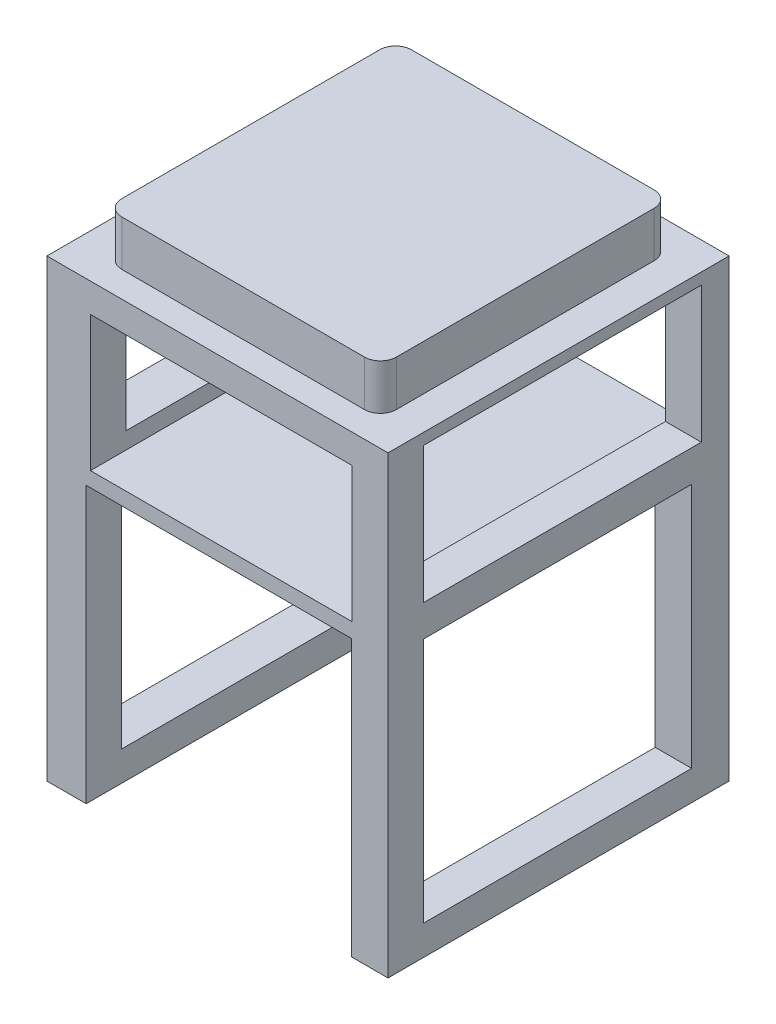
ISO-10303-21;
HEADER;
FILE_DESCRIPTION(('STEP AP214'),'2;1');
FILE_NAME('part.step','',(''),(''),'','','');
FILE_SCHEMA(('AUTOMOTIVE_DESIGN { 1 0 10303 214 1 1 1 1 }'));
ENDSEC;
DATA;
#1=APPLICATION_CONTEXT('core data for automotive mechanical design processes');
#2=APPLICATION_PROTOCOL_DEFINITION('international standard','automotive_design',2000,#1);
#3=PRODUCT_CONTEXT('',#1,'mechanical');
#4=PRODUCT('Part','Part','',(#3));
#5=PRODUCT_RELATED_PRODUCT_CATEGORY('part','',(#4));
#6=PRODUCT_DEFINITION_FORMATION('','',#4);
#7=PRODUCT_DEFINITION_CONTEXT('part definition',#1,'design');
#8=PRODUCT_DEFINITION('design','',#6,#7);
#9=PRODUCT_DEFINITION_SHAPE('','',#8);
#10=(LENGTH_UNIT() NAMED_UNIT(*) SI_UNIT(.MILLI.,.METRE.));
#11=(NAMED_UNIT(*) PLANE_ANGLE_UNIT() SI_UNIT($,.RADIAN.));
#12=(NAMED_UNIT(*) SI_UNIT($,.STERADIAN.) SOLID_ANGLE_UNIT());
#13=UNCERTAINTY_MEASURE_WITH_UNIT(LENGTH_MEASURE(1.E-05),#10,'distance_accuracy_value','');
#14=(GEOMETRIC_REPRESENTATION_CONTEXT(3) GLOBAL_UNCERTAINTY_ASSIGNED_CONTEXT((#13)) GLOBAL_UNIT_ASSIGNED_CONTEXT((#10,
#11,#12)) REPRESENTATION_CONTEXT('',''));
#15=CARTESIAN_POINT('',(0.,0.,0.));
#16=DIRECTION('',(0.,0.,1.));
#17=DIRECTION('',(1.,0.,0.));
#18=AXIS2_PLACEMENT_3D('',#15,#16,#17);
#19=CARTESIAN_POINT('',(0.,2000.,0.));
#20=DIRECTION('',(0.,1.,0.));
#21=DIRECTION('',(0.,0.,1.));
#22=AXIS2_PLACEMENT_3D('',#19,#20,#21);
#23=PLANE('',#22);
#24=DIRECTION('',(0.,0.,-1.));
#25=VECTOR('',#24,1.);
#26=CARTESIAN_POINT('',(750.,2000.,-750.));
#27=LINE('',#26,#25);
#28=CARTESIAN_POINT('',(750.,2000.,750.));
#29=VERTEX_POINT('',#28);
#30=CARTESIAN_POINT('',(750.,2000.,-750.));
#31=VERTEX_POINT('',#30);
#32=EDGE_CURVE('E449',#29,#31,#27,.T.);
#33=ORIENTED_EDGE('',*,*,#32,.T.);
#34=DIRECTION('',(-1.,0.,0.));
#35=VECTOR('',#34,1.);
#36=CARTESIAN_POINT('',(-750.,2000.,-750.));
#37=LINE('',#36,#35);
#38=CARTESIAN_POINT('',(-750.,2000.,-750.));
#39=VERTEX_POINT('',#38);
#40=EDGE_CURVE('E452',#31,#39,#37,.T.);
#41=ORIENTED_EDGE('',*,*,#40,.T.);
#42=DIRECTION('',(0.,0.,1.));
#43=VECTOR('',#42,1.);
#44=CARTESIAN_POINT('',(-750.,2000.,-750.));
#45=LINE('',#44,#43);
#46=CARTESIAN_POINT('',(-750.,2000.,750.));
#47=VERTEX_POINT('',#46);
#48=EDGE_CURVE('E455',#39,#47,#45,.T.);
#49=ORIENTED_EDGE('',*,*,#48,.T.);
#50=DIRECTION('',(1.,0.,0.));
#51=VECTOR('',#50,1.);
#52=CARTESIAN_POINT('',(-750.,2000.,750.));
#53=LINE('',#52,#51);
#54=EDGE_CURVE('E457',#47,#29,#53,.T.);
#55=ORIENTED_EDGE('',*,*,#54,.T.);
#56=EDGE_LOOP('',(#33,#41,#49,#55));
#57=FACE_BOUND('',#56,.T.);
#58=DIRECTION('',(-1.,0.,0.));
#59=VECTOR('',#58,1.);
#60=CARTESIAN_POINT('',(-533.551119556214,2000.,-636.730631364272));
#61=LINE('',#60,#59);
#62=CARTESIAN_POINT('',(533.551119556214,2000.,-636.730631364272));
#63=VERTEX_POINT('',#62);
#64=CARTESIAN_POINT('',(-533.551119556214,2000.,-636.730631364272));
#65=VERTEX_POINT('',#64);
#66=EDGE_CURVE('E903',#63,#65,#61,.T.);
#67=ORIENTED_EDGE('',*,*,#66,.F.);
#68=CARTESIAN_POINT('',(533.551119556214,2000.,-566.730631364272));
#69=DIRECTION('',(0.,1.,0.));
#70=DIRECTION('',(0.,0.,-1.));
#71=AXIS2_PLACEMENT_3D('',#68,#69,#70);
#72=CIRCLE('',#71,70.);
#73=CARTESIAN_POINT('',(603.551119556214,2000.,-566.730631364271));
#74=VERTEX_POINT('',#73);
#75=EDGE_CURVE('E289',#74,#63,#72,.T.);
#76=ORIENTED_EDGE('',*,*,#75,.F.);
#77=DIRECTION('',(0.,0.,-1.));
#78=VECTOR('',#77,1.);
#79=CARTESIAN_POINT('',(603.551119556214,2000.,-566.730631364271));
#80=LINE('',#79,#78);
#81=CARTESIAN_POINT('',(603.551119556214,2000.,566.730631364271));
#82=VERTEX_POINT('',#81);
#83=EDGE_CURVE('E285',#82,#74,#80,.T.);
#84=ORIENTED_EDGE('',*,*,#83,.F.);
#85=CARTESIAN_POINT('',(533.551119556214,2000.,566.730631364272));
#86=DIRECTION('',(0.,1.,0.));
#87=DIRECTION('',(0.,0.,1.));
#88=AXIS2_PLACEMENT_3D('',#85,#86,#87);
#89=CIRCLE('',#88,70.);
#90=CARTESIAN_POINT('',(533.551119556214,2000.,636.730631364272));
#91=VERTEX_POINT('',#90);
#92=EDGE_CURVE('E899',#91,#82,#89,.T.);
#93=ORIENTED_EDGE('',*,*,#92,.F.);
#94=DIRECTION('',(1.,0.,0.));
#95=VECTOR('',#94,1.);
#96=CARTESIAN_POINT('',(-533.551119556214,2000.,636.730631364272));
#97=LINE('',#96,#95);
#98=CARTESIAN_POINT('',(-533.551119556214,2000.,636.730631364272));
#99=VERTEX_POINT('',#98);
#100=EDGE_CURVE('E915',#99,#91,#97,.T.);
#101=ORIENTED_EDGE('',*,*,#100,.F.);
#102=CARTESIAN_POINT('',(-533.551119556214,2000.,566.730631364272));
#103=DIRECTION('',(0.,1.,0.));
#104=DIRECTION('',(0.,0.,1.));
#105=AXIS2_PLACEMENT_3D('',#102,#103,#104);
#106=CIRCLE('',#105,70.);
#107=CARTESIAN_POINT('',(-603.551119556214,2000.,566.730631364271));
#108=VERTEX_POINT('',#107);
#109=EDGE_CURVE('E913',#108,#99,#106,.T.);
#110=ORIENTED_EDGE('',*,*,#109,.F.);
#111=DIRECTION('',(0.,0.,1.));
#112=VECTOR('',#111,1.);
#113=CARTESIAN_POINT('',(-603.551119556214,2000.,-566.730631364271));
#114=LINE('',#113,#112);
#115=CARTESIAN_POINT('',(-603.551119556214,2000.,-566.730631364271));
#116=VERTEX_POINT('',#115);
#117=EDGE_CURVE('E911',#116,#108,#114,.T.);
#118=ORIENTED_EDGE('',*,*,#117,.F.);
#119=CARTESIAN_POINT('',(-533.551119556214,2000.,-566.730631364272));
#120=DIRECTION('',(0.,1.,0.));
#121=DIRECTION('',(0.,0.,1.));
#122=AXIS2_PLACEMENT_3D('',#119,#120,#121);
#123=CIRCLE('',#122,70.);
#124=EDGE_CURVE('E905',#65,#116,#123,.T.);
#125=ORIENTED_EDGE('',*,*,#124,.F.);
#126=EDGE_LOOP('',(#67,#76,#84,#93,#101,#110,#118,#125));
#127=FACE_BOUND('',#126,.T.);
#128=ADVANCED_FACE('F33',(#57,#127),#23,.T.);
#129=CARTESIAN_POINT('',(0.,0.,0.));
#130=DIRECTION('',(0.,1.,0.));
#131=DIRECTION('',(0.,0.,1.));
#132=AXIS2_PLACEMENT_3D('',#129,#130,#131);
#133=PLANE('',#132);
#134=DIRECTION('',(1.,0.,0.));
#135=VECTOR('',#134,1.);
#136=CARTESIAN_POINT('',(-750.,0.,750.));
#137=LINE('',#136,#135);
#138=CARTESIAN_POINT('',(589.857987698919,0.,750.));
#139=VERTEX_POINT('',#138);
#140=CARTESIAN_POINT('',(750.,0.,750.));
#141=VERTEX_POINT('',#140);
#142=EDGE_CURVE('E468',#139,#141,#137,.T.);
#143=ORIENTED_EDGE('',*,*,#142,.F.);
#144=DIRECTION('',(0.,0.,1.));
#145=VECTOR('',#144,1.);
#146=CARTESIAN_POINT('',(589.857987698919,0.,-1250.));
#147=LINE('',#146,#145);
#148=CARTESIAN_POINT('',(589.857987698919,0.,-750.));
#149=VERTEX_POINT('',#148);
#150=EDGE_CURVE('E304',#149,#139,#147,.T.);
#151=ORIENTED_EDGE('',*,*,#150,.F.);
#152=DIRECTION('',(-1.,0.,0.));
#153=VECTOR('',#152,1.);
#154=CARTESIAN_POINT('',(-750.,0.,-750.));
#155=LINE('',#154,#153);
#156=CARTESIAN_POINT('',(750.,0.,-750.));
#157=VERTEX_POINT('',#156);
#158=EDGE_CURVE('E463',#157,#149,#155,.T.);
#159=ORIENTED_EDGE('',*,*,#158,.F.);
#160=DIRECTION('',(0.,0.,-1.));
#161=VECTOR('',#160,1.);
#162=CARTESIAN_POINT('',(750.,0.,-750.));
#163=LINE('',#162,#161);
#164=EDGE_CURVE('E448',#141,#157,#163,.T.);
#165=ORIENTED_EDGE('',*,*,#164,.F.);
#166=EDGE_LOOP('',(#143,#151,#159,#165));
#167=FACE_BOUND('',#166,.T.);
#168=ADVANCED_FACE('F556',(#167),#133,.F.);
#169=CARTESIAN_POINT('',(-1250.,1212.77020270569,-585.35484328997));
#170=DIRECTION('',(0.,0.,-1.));
#171=DIRECTION('',(-1.,0.,0.));
#172=AXIS2_PLACEMENT_3D('',#169,#170,#171);
#173=PLANE('',#172);
#174=DIRECTION('',(1.,0.,0.));
#175=VECTOR('',#174,1.);
#176=CARTESIAN_POINT('',(-1250.,1212.77020270569,-585.35484328997));
#177=LINE('',#176,#175);
#178=CARTESIAN_POINT('',(589.857987698919,1212.77020270569,-585.354843289971));
#179=VERTEX_POINT('',#178);
#180=CARTESIAN_POINT('',(750.,1212.77020270569,-585.354843289971));
#181=VERTEX_POINT('',#180);
#182=EDGE_CURVE('E352',#179,#181,#177,.T.);
#183=ORIENTED_EDGE('',*,*,#182,.F.);
#184=DIRECTION('',(0.,-1.,0.));
#185=VECTOR('',#184,1.);
#186=CARTESIAN_POINT('',(589.857987698918,1212.77020270569,-585.354843289971));
#187=LINE('',#186,#185);
#188=CARTESIAN_POINT('',(589.857987698918,130.70437451714,-585.354843289971));
#189=VERTEX_POINT('',#188);
#190=EDGE_CURVE('E331',#179,#189,#187,.T.);
#191=ORIENTED_EDGE('',*,*,#190,.T.);
#192=DIRECTION('',(1.,0.,0.));
#193=VECTOR('',#192,1.);
#194=CARTESIAN_POINT('',(-1250.,130.70437451714,-585.35484328997));
#195=LINE('',#194,#193);
#196=CARTESIAN_POINT('',(750.,130.70437451714,-585.354843289971));
#197=VERTEX_POINT('',#196);
#198=EDGE_CURVE('E357',#189,#197,#195,.T.);
#199=ORIENTED_EDGE('',*,*,#198,.T.);
#200=DIRECTION('',(0.,1.,0.));
#201=VECTOR('',#200,1.);
#202=CARTESIAN_POINT('',(750.,1212.77020270569,-585.354843289971));
#203=LINE('',#202,#201);
#204=EDGE_CURVE('E340',#197,#181,#203,.T.);
#205=ORIENTED_EDGE('',*,*,#204,.T.);
#206=EDGE_LOOP('',(#183,#191,#199,#205));
#207=FACE_BOUND('',#206,.T.);
#208=ADVANCED_FACE('F540',(#207),#173,.F.);
#209=CARTESIAN_POINT('',(-1250.,130.70437451714,594.091482742061));
#210=DIRECTION('',(0.,-1.,0.));
#211=DIRECTION('',(0.,0.,-1.));
#212=AXIS2_PLACEMENT_3D('',#209,#210,#211);
#213=PLANE('',#212);
#214=ORIENTED_EDGE('',*,*,#198,.F.);
#215=DIRECTION('',(0.,0.,1.));
#216=VECTOR('',#215,1.);
#217=CARTESIAN_POINT('',(589.857987698918,130.70437451714,594.091482742061));
#218=LINE('',#217,#216);
#219=CARTESIAN_POINT('',(589.857987698918,130.70437451714,594.09148274206));
#220=VERTEX_POINT('',#219);
#221=EDGE_CURVE('E328',#189,#220,#218,.T.);
#222=ORIENTED_EDGE('',*,*,#221,.T.);
#223=DIRECTION('',(1.,0.,0.));
#224=VECTOR('',#223,1.);
#225=CARTESIAN_POINT('',(-1250.,130.70437451714,594.091482742061));
#226=LINE('',#225,#224);
#227=CARTESIAN_POINT('',(750.,130.70437451714,594.09148274206));
#228=VERTEX_POINT('',#227);
#229=EDGE_CURVE('E361',#220,#228,#226,.T.);
#230=ORIENTED_EDGE('',*,*,#229,.T.);
#231=DIRECTION('',(0.,0.,-1.));
#232=VECTOR('',#231,1.);
#233=CARTESIAN_POINT('',(750.,130.70437451714,594.09148274206));
#234=LINE('',#233,#232);
#235=EDGE_CURVE('E349',#228,#197,#234,.T.);
#236=ORIENTED_EDGE('',*,*,#235,.T.);
#237=EDGE_LOOP('',(#214,#222,#230,#236));
#238=FACE_BOUND('',#237,.T.);
#239=ADVANCED_FACE('F542',(#238),#213,.F.);
#240=CARTESIAN_POINT('',(-1250.,1212.77020270569,594.091482742061));
#241=DIRECTION('',(0.,0.,1.));
#242=DIRECTION('',(1.,0.,0.));
#243=AXIS2_PLACEMENT_3D('',#240,#241,#242);
#244=PLANE('',#243);
#245=ORIENTED_EDGE('',*,*,#229,.F.);
#246=DIRECTION('',(0.,1.,0.));
#247=VECTOR('',#246,1.);
#248=CARTESIAN_POINT('',(589.857987698918,1212.77020270569,594.091482742061));
#249=LINE('',#248,#247);
#250=CARTESIAN_POINT('',(589.857987698919,1212.77020270569,594.091482742061));
#251=VERTEX_POINT('',#250);
#252=EDGE_CURVE('E325',#220,#251,#249,.T.);
#253=ORIENTED_EDGE('',*,*,#252,.T.);
#254=DIRECTION('',(1.,0.,0.));
#255=VECTOR('',#254,1.);
#256=CARTESIAN_POINT('',(-1250.,1212.77020270569,594.091482742061));
#257=LINE('',#256,#255);
#258=CARTESIAN_POINT('',(750.,1212.77020270569,594.09148274206));
#259=VERTEX_POINT('',#258);
#260=EDGE_CURVE('E365',#251,#259,#257,.T.);
#261=ORIENTED_EDGE('',*,*,#260,.T.);
#262=DIRECTION('',(0.,-1.,0.));
#263=VECTOR('',#262,1.);
#264=CARTESIAN_POINT('',(750.,1212.77020270569,594.09148274206));
#265=LINE('',#264,#263);
#266=EDGE_CURVE('E346',#259,#228,#265,.T.);
#267=ORIENTED_EDGE('',*,*,#266,.T.);
#268=EDGE_LOOP('',(#245,#253,#261,#267));
#269=FACE_BOUND('',#268,.T.);
#270=ADVANCED_FACE('F551',(#269),#244,.F.);
#271=CARTESIAN_POINT('',(750.,2000.,-750.));
#272=DIRECTION('',(-1.,0.,0.));
#273=DIRECTION('',(0.,0.,1.));
#274=AXIS2_PLACEMENT_3D('',#271,#272,#273);
#275=PLANE('',#274);
#276=DIRECTION('',(0.,0.,1.));
#277=VECTOR('',#276,1.);
#278=CARTESIAN_POINT('',(750.,1212.77020270569,594.09148274206));
#279=LINE('',#278,#277);
#280=EDGE_CURVE('E343',#181,#259,#279,.T.);
#281=ORIENTED_EDGE('',*,*,#280,.F.);
#282=ORIENTED_EDGE('',*,*,#204,.F.);
#283=ORIENTED_EDGE('',*,*,#235,.F.);
#284=ORIENTED_EDGE('',*,*,#266,.F.);
#285=EDGE_LOOP('',(#281,#282,#283,#284));
#286=FACE_BOUND('',#285,.T.);
#287=ORIENTED_EDGE('',*,*,#164,.T.);
#288=DIRECTION('',(0.,-1.,0.));
#289=VECTOR('',#288,1.);
#290=CARTESIAN_POINT('',(750.,2000.,-750.));
#291=LINE('',#290,#289);
#292=EDGE_CURVE('E479',#31,#157,#291,.T.);
#293=ORIENTED_EDGE('',*,*,#292,.F.);
#294=ORIENTED_EDGE('',*,*,#32,.F.);
#295=DIRECTION('',(0.,-1.,0.));
#296=VECTOR('',#295,1.);
#297=CARTESIAN_POINT('',(750.,2000.,750.));
#298=LINE('',#297,#296);
#299=EDGE_CURVE('E459',#29,#141,#298,.T.);
#300=ORIENTED_EDGE('',*,*,#299,.T.);
#301=EDGE_LOOP('',(#287,#293,#294,#300));
#302=FACE_BOUND('',#301,.T.);
#303=DIRECTION('',(0.,-1.,0.));
#304=VECTOR('',#303,1.);
#305=CARTESIAN_POINT('',(750.,0.,-627.777429765277));
#306=LINE('',#305,#304);
#307=CARTESIAN_POINT('',(750.,1950.09268732934,-627.777429765277));
#308=VERTEX_POINT('',#307);
#309=CARTESIAN_POINT('',(750.,1351.808156949,-627.777429765277));
#310=VERTEX_POINT('',#309);
#311=EDGE_CURVE('E356',#308,#310,#306,.T.);
#312=ORIENTED_EDGE('',*,*,#311,.T.);
#313=DIRECTION('',(0.,0.,-1.));
#314=VECTOR('',#313,1.);
#315=CARTESIAN_POINT('',(750.,1351.808156949,-1.28452768236437E-13));
#316=LINE('',#315,#314);
#317=CARTESIAN_POINT('',(750.,1351.808156949,594.071259039625));
#318=VERTEX_POINT('',#317);
#319=EDGE_CURVE('E377',#318,#310,#316,.T.);
#320=ORIENTED_EDGE('',*,*,#319,.F.);
#321=DIRECTION('',(0.,-1.,0.));
#322=VECTOR('',#321,1.);
#323=CARTESIAN_POINT('',(750.,-1.10240455262075E-13,594.071259039625));
#324=LINE('',#323,#322);
#325=CARTESIAN_POINT('',(750.,1950.09268732934,594.071259039625));
#326=VERTEX_POINT('',#325);
#327=EDGE_CURVE('E374',#326,#318,#324,.T.);
#328=ORIENTED_EDGE('',*,*,#327,.F.);
#329=DIRECTION('',(0.,0.,-1.));
#330=VECTOR('',#329,1.);
#331=CARTESIAN_POINT('',(750.,1950.09268732934,-1.28452768236437E-13));
#332=LINE('',#331,#330);
#333=EDGE_CURVE('E371',#326,#308,#332,.T.);
#334=ORIENTED_EDGE('',*,*,#333,.T.);
#335=EDGE_LOOP('',(#312,#320,#328,#334));
#336=FACE_BOUND('',#335,.T.);
#337=ADVANCED_FACE('F35',(#286,#302,#336),#275,.F.);
#338=CARTESIAN_POINT('',(-750.,2000.,-750.));
#339=DIRECTION('',(1.,0.,0.));
#340=DIRECTION('',(0.,0.,-1.));
#341=AXIS2_PLACEMENT_3D('',#338,#339,#340);
#342=PLANE('',#341);
#343=DIRECTION('',(0.,0.,-1.));
#344=VECTOR('',#343,1.);
#345=CARTESIAN_POINT('',(-750.,130.70437451714,-750.));
#346=LINE('',#345,#344);
#347=CARTESIAN_POINT('',(-750.,130.70437451714,594.091482742061));
#348=VERTEX_POINT('',#347);
#349=CARTESIAN_POINT('',(-750.,130.70437451714,-585.35484328997));
#350=VERTEX_POINT('',#349);
#351=EDGE_CURVE('E41',#348,#350,#346,.T.);
#352=ORIENTED_EDGE('',*,*,#351,.T.);
#353=DIRECTION('',(0.,1.,0.));
#354=VECTOR('',#353,1.);
#355=CARTESIAN_POINT('',(-750.,2000.,-585.35484328997));
#356=LINE('',#355,#354);
#357=CARTESIAN_POINT('',(-750.,1212.77020270569,-585.35484328997));
#358=VERTEX_POINT('',#357);
#359=EDGE_CURVE('E11',#350,#358,#356,.T.);
#360=ORIENTED_EDGE('',*,*,#359,.T.);
#361=DIRECTION('',(0.,0.,1.));
#362=VECTOR('',#361,1.);
#363=CARTESIAN_POINT('',(-750.,1212.77020270569,-750.));
#364=LINE('',#363,#362);
#365=CARTESIAN_POINT('',(-750.,1212.77020270569,594.091482742061));
#366=VERTEX_POINT('',#365);
#367=EDGE_CURVE('E492',#358,#366,#364,.T.);
#368=ORIENTED_EDGE('',*,*,#367,.T.);
#369=DIRECTION('',(0.,-1.,0.));
#370=VECTOR('',#369,1.);
#371=CARTESIAN_POINT('',(-750.,2000.,594.091482742061));
#372=LINE('',#371,#370);
#373=EDGE_CURVE('E495',#366,#348,#372,.T.);
#374=ORIENTED_EDGE('',*,*,#373,.T.);
#375=EDGE_LOOP('',(#352,#360,#368,#374));
#376=FACE_BOUND('',#375,.T.);
#377=DIRECTION('',(0.,0.,1.));
#378=VECTOR('',#377,1.);
#379=CARTESIAN_POINT('',(-750.,0.,-750.));
#380=LINE('',#379,#378);
#381=CARTESIAN_POINT('',(-750.,0.,-750.));
#382=VERTEX_POINT('',#381);
#383=CARTESIAN_POINT('',(-750.,0.,750.));
#384=VERTEX_POINT('',#383);
#385=EDGE_CURVE('E466',#382,#384,#380,.T.);
#386=ORIENTED_EDGE('',*,*,#385,.T.);
#387=DIRECTION('',(0.,-1.,0.));
#388=VECTOR('',#387,1.);
#389=CARTESIAN_POINT('',(-750.,2000.,750.));
#390=LINE('',#389,#388);
#391=EDGE_CURVE('E473',#47,#384,#390,.T.);
#392=ORIENTED_EDGE('',*,*,#391,.F.);
#393=ORIENTED_EDGE('',*,*,#48,.F.);
#394=DIRECTION('',(0.,-1.,0.));
#395=VECTOR('',#394,1.);
#396=CARTESIAN_POINT('',(-750.,2000.,-750.));
#397=LINE('',#396,#395);
#398=EDGE_CURVE('E476',#39,#382,#397,.T.);
#399=ORIENTED_EDGE('',*,*,#398,.T.);
#400=EDGE_LOOP('',(#386,#392,#393,#399));
#401=FACE_BOUND('',#400,.T.);
#402=DIRECTION('',(0.,-1.,0.));
#403=VECTOR('',#402,1.);
#404=CARTESIAN_POINT('',(-750.,2000.,-627.777429765277));
#405=LINE('',#404,#403);
#406=CARTESIAN_POINT('',(-750.,1950.09268732934,-627.777429765277));
#407=VERTEX_POINT('',#406);
#408=CARTESIAN_POINT('',(-750.,1351.808156949,-627.777429765277));
#409=VERTEX_POINT('',#408);
#410=EDGE_CURVE('E404',#407,#409,#405,.T.);
#411=ORIENTED_EDGE('',*,*,#410,.F.);
#412=DIRECTION('',(0.,0.,-1.));
#413=VECTOR('',#412,1.);
#414=CARTESIAN_POINT('',(-750.,1950.09268732934,-750.));
#415=LINE('',#414,#413);
#416=CARTESIAN_POINT('',(-750.,1950.09268732934,594.071259039625));
#417=VERTEX_POINT('',#416);
#418=EDGE_CURVE('E490',#417,#407,#415,.T.);
#419=ORIENTED_EDGE('',*,*,#418,.F.);
#420=DIRECTION('',(0.,-1.,0.));
#421=VECTOR('',#420,1.);
#422=CARTESIAN_POINT('',(-750.,2000.,594.071259039625));
#423=LINE('',#422,#421);
#424=CARTESIAN_POINT('',(-750.,1351.808156949,594.071259039625));
#425=VERTEX_POINT('',#424);
#426=EDGE_CURVE('E397',#417,#425,#423,.T.);
#427=ORIENTED_EDGE('',*,*,#426,.T.);
#428=DIRECTION('',(0.,0.,-1.));
#429=VECTOR('',#428,1.);
#430=CARTESIAN_POINT('',(-750.,1351.808156949,-750.));
#431=LINE('',#430,#429);
#432=EDGE_CURVE('E409',#425,#409,#431,.T.);
#433=ORIENTED_EDGE('',*,*,#432,.T.);
#434=EDGE_LOOP('',(#411,#419,#427,#433));
#435=FACE_BOUND('',#434,.T.);
#436=ADVANCED_FACE('F499',(#376,#401,#435),#342,.F.);
#437=CARTESIAN_POINT('',(592.401457428046,1873.00608050566,-1250.));
#438=DIRECTION('',(1.,0.,0.));
#439=DIRECTION('',(0.,0.,-1.));
#440=AXIS2_PLACEMENT_3D('',#437,#438,#439);
#441=PLANE('',#440);
#442=DIRECTION('',(0.,-1.,0.));
#443=VECTOR('',#442,1.);
#444=CARTESIAN_POINT('',(592.401457428046,1873.00608050566,-627.777429765277));
#445=LINE('',#444,#443);
#446=CARTESIAN_POINT('',(592.401457428046,1873.00608050566,-627.777429765277));
#447=VERTEX_POINT('',#446);
#448=CARTESIAN_POINT('',(592.401457428046,1351.808156949,-627.777429765277));
#449=VERTEX_POINT('',#448);
#450=EDGE_CURVE('E402',#447,#449,#445,.T.);
#451=ORIENTED_EDGE('',*,*,#450,.F.);
#452=DIRECTION('',(0.,0.,1.));
#453=VECTOR('',#452,1.);
#454=CARTESIAN_POINT('',(592.401457428046,1873.00608050566,-1250.));
#455=LINE('',#454,#453);
#456=CARTESIAN_POINT('',(592.401457428046,1873.00608050566,-750.));
#457=VERTEX_POINT('',#456);
#458=EDGE_CURVE('E434',#457,#447,#455,.T.);
#459=ORIENTED_EDGE('',*,*,#458,.F.);
#460=DIRECTION('',(0.,1.,0.));
#461=VECTOR('',#460,1.);
#462=CARTESIAN_POINT('',(592.401457428046,2000.,-750.));
#463=LINE('',#462,#461);
#464=CARTESIAN_POINT('',(592.401457428046,1278.14640930617,-750.));
#465=VERTEX_POINT('',#464);
#466=EDGE_CURVE('E445',#465,#457,#463,.T.);
#467=ORIENTED_EDGE('',*,*,#466,.F.);
#468=DIRECTION('',(0.,0.,1.));
#469=VECTOR('',#468,1.);
#470=CARTESIAN_POINT('',(592.401457428046,1278.14640930617,-1250.));
#471=LINE('',#470,#469);
#472=CARTESIAN_POINT('',(592.401457428046,1278.14640930617,750.));
#473=VERTEX_POINT('',#472);
#474=EDGE_CURVE('E425',#465,#473,#471,.T.);
#475=ORIENTED_EDGE('',*,*,#474,.T.);
#476=DIRECTION('',(0.,1.,0.));
#477=VECTOR('',#476,1.);
#478=CARTESIAN_POINT('',(592.401457428046,1873.00608050566,750.));
#479=LINE('',#478,#477);
#480=CARTESIAN_POINT('',(592.401457428046,1873.00608050566,750.));
#481=VERTEX_POINT('',#480);
#482=EDGE_CURVE('E412',#473,#481,#479,.T.);
#483=ORIENTED_EDGE('',*,*,#482,.T.);
#484=CARTESIAN_POINT('',(592.401457428046,1873.00608050566,594.071259039625));
#485=VERTEX_POINT('',#484);
#486=EDGE_CURVE('E424',#485,#481,#455,.T.);
#487=ORIENTED_EDGE('',*,*,#486,.F.);
#488=DIRECTION('',(0.,-1.,0.));
#489=VECTOR('',#488,1.);
#490=CARTESIAN_POINT('',(592.401457428046,1873.00608050566,594.071259039625));
#491=LINE('',#490,#489);
#492=CARTESIAN_POINT('',(592.401457428046,1351.808156949,594.071259039625));
#493=VERTEX_POINT('',#492);
#494=EDGE_CURVE('E394',#485,#493,#491,.T.);
#495=ORIENTED_EDGE('',*,*,#494,.T.);
#496=DIRECTION('',(0.,0.,-1.));
#497=VECTOR('',#496,1.);
#498=CARTESIAN_POINT('',(592.401457428046,1351.808156949,-1250.));
#499=LINE('',#498,#497);
#500=EDGE_CURVE('E406',#493,#449,#499,.T.);
#501=ORIENTED_EDGE('',*,*,#500,.T.);
#502=EDGE_LOOP('',(#451,#459,#467,#475,#483,#487,#495,#501));
#503=FACE_BOUND('',#502,.T.);
#504=ADVANCED_FACE('F565',(#503),#441,.F.);
#505=CARTESIAN_POINT('',(-558.551317086931,1873.00608050566,-1250.));
#506=DIRECTION('',(-1.,0.,0.));
#507=DIRECTION('',(0.,0.,1.));
#508=AXIS2_PLACEMENT_3D('',#505,#506,#507);
#509=PLANE('',#508);
#510=DIRECTION('',(0.,1.,0.));
#511=VECTOR('',#510,1.);
#512=CARTESIAN_POINT('',(-558.551317086931,1873.00608050566,-627.777429765277));
#513=LINE('',#512,#511);
#514=CARTESIAN_POINT('',(-558.551317086931,1351.808156949,-627.777429765277));
#515=VERTEX_POINT('',#514);
#516=CARTESIAN_POINT('',(-558.551317086931,1873.00608050566,-627.777429765277));
#517=VERTEX_POINT('',#516);
#518=EDGE_CURVE('E400',#515,#517,#513,.T.);
#519=ORIENTED_EDGE('',*,*,#518,.F.);
#520=DIRECTION('',(0.,0.,1.));
#521=VECTOR('',#520,1.);
#522=CARTESIAN_POINT('',(-558.551317086931,1351.808156949,-1250.));
#523=LINE('',#522,#521);
#524=CARTESIAN_POINT('',(-558.551317086931,1351.808156949,594.071259039625));
#525=VERTEX_POINT('',#524);
#526=EDGE_CURVE('E487',#515,#525,#523,.T.);
#527=ORIENTED_EDGE('',*,*,#526,.T.);
#528=DIRECTION('',(0.,1.,0.));
#529=VECTOR('',#528,1.);
#530=CARTESIAN_POINT('',(-558.551317086931,1873.00608050566,594.071259039625));
#531=LINE('',#530,#529);
#532=CARTESIAN_POINT('',(-558.551317086931,1873.00608050566,594.071259039625));
#533=VERTEX_POINT('',#532);
#534=EDGE_CURVE('E391',#525,#533,#531,.T.);
#535=ORIENTED_EDGE('',*,*,#534,.T.);
#536=DIRECTION('',(0.,0.,1.));
#537=VECTOR('',#536,1.);
#538=CARTESIAN_POINT('',(-558.551317086931,1873.00608050566,-1250.));
#539=LINE('',#538,#537);
#540=CARTESIAN_POINT('',(-558.551317086931,1873.00608050566,750.));
#541=VERTEX_POINT('',#540);
#542=EDGE_CURVE('E433',#533,#541,#539,.T.);
#543=ORIENTED_EDGE('',*,*,#542,.T.);
#544=DIRECTION('',(0.,-1.,0.));
#545=VECTOR('',#544,1.);
#546=CARTESIAN_POINT('',(-558.551317086931,1873.00608050566,750.));
#547=LINE('',#546,#545);
#548=CARTESIAN_POINT('',(-558.551317086931,1278.14640930617,750.));
#549=VERTEX_POINT('',#548);
#550=EDGE_CURVE('E418',#541,#549,#547,.T.);
#551=ORIENTED_EDGE('',*,*,#550,.T.);
#552=DIRECTION('',(0.,0.,1.));
#553=VECTOR('',#552,1.);
#554=CARTESIAN_POINT('',(-558.551317086931,1278.14640930617,-1250.));
#555=LINE('',#554,#553);
#556=CARTESIAN_POINT('',(-558.551317086931,1278.14640930617,-750.));
#557=VERTEX_POINT('',#556);
#558=EDGE_CURVE('E428',#557,#549,#555,.T.);
#559=ORIENTED_EDGE('',*,*,#558,.F.);
#560=DIRECTION('',(0.,-1.,0.));
#561=VECTOR('',#560,1.);
#562=CARTESIAN_POINT('',(-558.551317086931,2000.,-750.));
#563=LINE('',#562,#561);
#564=CARTESIAN_POINT('',(-558.551317086931,1873.00608050566,-750.));
#565=VERTEX_POINT('',#564);
#566=EDGE_CURVE('E439',#565,#557,#563,.T.);
#567=ORIENTED_EDGE('',*,*,#566,.F.);
#568=EDGE_CURVE('E430',#565,#517,#539,.T.);
#569=ORIENTED_EDGE('',*,*,#568,.T.);
#570=EDGE_LOOP('',(#519,#527,#535,#543,#551,#559,#567,#569));
#571=FACE_BOUND('',#570,.T.);
#572=ADVANCED_FACE('F580',(#571),#509,.F.);
#573=CARTESIAN_POINT('',(-558.551317086931,1873.00608050566,-1250.));
#574=DIRECTION('',(0.,1.,0.));
#575=DIRECTION('',(0.,0.,1.));
#576=AXIS2_PLACEMENT_3D('',#573,#574,#575);
#577=PLANE('',#576);
#578=DIRECTION('',(1.,0.,0.));
#579=VECTOR('',#578,1.);
#580=CARTESIAN_POINT('',(-558.55131708693,1873.00608050566,-627.777429765277));
#581=LINE('',#580,#579);
#582=EDGE_CURVE('E485',#517,#447,#581,.T.);
#583=ORIENTED_EDGE('',*,*,#582,.F.);
#584=ORIENTED_EDGE('',*,*,#568,.F.);
#585=DIRECTION('',(-1.,0.,0.));
#586=VECTOR('',#585,1.);
#587=CARTESIAN_POINT('',(-750.,1873.00608050566,-750.));
#588=LINE('',#587,#586);
#589=EDGE_CURVE('E427',#457,#565,#588,.T.);
#590=ORIENTED_EDGE('',*,*,#589,.F.);
#591=ORIENTED_EDGE('',*,*,#458,.T.);
#592=EDGE_LOOP('',(#583,#584,#590,#591));
#593=FACE_BOUND('',#592,.T.);
#594=ADVANCED_FACE('F586',(#593),#577,.F.);
#595=CARTESIAN_POINT('',(-750.,2000.,-750.));
#596=DIRECTION('',(0.,0.,1.));
#597=DIRECTION('',(1.,0.,0.));
#598=AXIS2_PLACEMENT_3D('',#595,#596,#597);
#599=PLANE('',#598);
#600=ORIENTED_EDGE('',*,*,#158,.T.);
#601=DIRECTION('',(0.,1.,0.));
#602=VECTOR('',#601,1.);
#603=CARTESIAN_POINT('',(589.857987698919,2000.,-750.));
#604=LINE('',#603,#602);
#605=CARTESIAN_POINT('',(589.857987698919,1212.77020270569,-750.));
#606=VERTEX_POINT('',#605);
#607=EDGE_CURVE('E334',#149,#606,#604,.T.);
#608=ORIENTED_EDGE('',*,*,#607,.T.);
#609=DIRECTION('',(-1.,0.,0.));
#610=VECTOR('',#609,1.);
#611=CARTESIAN_POINT('',(-750.,1212.77020270569,-750.));
#612=LINE('',#611,#610);
#613=CARTESIAN_POINT('',(-577.218173676799,1212.77020270569,-750.));
#614=VERTEX_POINT('',#613);
#615=EDGE_CURVE('E337',#606,#614,#612,.T.);
#616=ORIENTED_EDGE('',*,*,#615,.T.);
#617=DIRECTION('',(0.,-1.,0.));
#618=VECTOR('',#617,1.);
#619=CARTESIAN_POINT('',(-577.218173676799,2000.,-750.));
#620=LINE('',#619,#618);
#621=CARTESIAN_POINT('',(-577.218173676798,0.,-750.));
#622=VERTEX_POINT('',#621);
#623=EDGE_CURVE('E322',#614,#622,#620,.T.);
#624=ORIENTED_EDGE('',*,*,#623,.T.);
#625=EDGE_CURVE('E462',#622,#382,#155,.T.);
#626=ORIENTED_EDGE('',*,*,#625,.T.);
#627=ORIENTED_EDGE('',*,*,#398,.F.);
#628=ORIENTED_EDGE('',*,*,#40,.F.);
#629=ORIENTED_EDGE('',*,*,#292,.T.);
#630=EDGE_LOOP('',(#600,#608,#616,#624,#626,#627,#628,#629));
#631=FACE_BOUND('',#630,.T.);
#632=DIRECTION('',(1.,0.,0.));
#633=VECTOR('',#632,1.);
#634=CARTESIAN_POINT('',(-750.,1278.14640930617,-750.));
#635=LINE('',#634,#633);
#636=EDGE_CURVE('E442',#557,#465,#635,.T.);
#637=ORIENTED_EDGE('',*,*,#636,.T.);
#638=ORIENTED_EDGE('',*,*,#466,.T.);
#639=ORIENTED_EDGE('',*,*,#589,.T.);
#640=ORIENTED_EDGE('',*,*,#566,.T.);
#641=EDGE_LOOP('',(#637,#638,#639,#640));
#642=FACE_BOUND('',#641,.T.);
#643=ADVANCED_FACE('F529',(#631,#642),#599,.F.);
#644=CARTESIAN_POINT('',(-750.,2000.,750.));
#645=DIRECTION('',(0.,0.,-1.));
#646=DIRECTION('',(-1.,0.,0.));
#647=AXIS2_PLACEMENT_3D('',#644,#645,#646);
#648=PLANE('',#647);
#649=DIRECTION('',(-1.,0.,0.));
#650=VECTOR('',#649,1.);
#651=CARTESIAN_POINT('',(-558.551317086931,1873.00608050566,750.));
#652=LINE('',#651,#650);
#653=EDGE_CURVE('E415',#481,#541,#652,.T.);
#654=ORIENTED_EDGE('',*,*,#653,.F.);
#655=ORIENTED_EDGE('',*,*,#482,.F.);
#656=DIRECTION('',(1.,0.,0.));
#657=VECTOR('',#656,1.);
#658=CARTESIAN_POINT('',(-558.551317086931,1278.14640930617,750.));
#659=LINE('',#658,#657);
#660=EDGE_CURVE('E421',#549,#473,#659,.T.);
#661=ORIENTED_EDGE('',*,*,#660,.F.);
#662=ORIENTED_EDGE('',*,*,#550,.F.);
#663=EDGE_LOOP('',(#654,#655,#661,#662));
#664=FACE_BOUND('',#663,.T.);
#665=DIRECTION('',(-1.,0.,0.));
#666=VECTOR('',#665,1.);
#667=CARTESIAN_POINT('',(-577.218173676799,1212.77020270569,750.));
#668=LINE('',#667,#666);
#669=CARTESIAN_POINT('',(589.857987698919,1212.77020270569,750.));
#670=VERTEX_POINT('',#669);
#671=CARTESIAN_POINT('',(-577.218173676799,1212.77020270569,750.));
#672=VERTEX_POINT('',#671);
#673=EDGE_CURVE('E294',#670,#672,#668,.T.);
#674=ORIENTED_EDGE('',*,*,#673,.F.);
#675=DIRECTION('',(0.,1.,0.));
#676=VECTOR('',#675,1.);
#677=CARTESIAN_POINT('',(589.857987698919,1212.77020270569,750.));
#678=LINE('',#677,#676);
#679=EDGE_CURVE('E291',#139,#670,#678,.T.);
#680=ORIENTED_EDGE('',*,*,#679,.F.);
#681=ORIENTED_EDGE('',*,*,#142,.T.);
#682=ORIENTED_EDGE('',*,*,#299,.F.);
#683=ORIENTED_EDGE('',*,*,#54,.F.);
#684=ORIENTED_EDGE('',*,*,#391,.T.);
#685=CARTESIAN_POINT('',(-577.218173676799,0.,750.));
#686=VERTEX_POINT('',#685);
#687=EDGE_CURVE('E453',#384,#686,#137,.T.);
#688=ORIENTED_EDGE('',*,*,#687,.T.);
#689=DIRECTION('',(0.,-1.,0.));
#690=VECTOR('',#689,1.);
#691=CARTESIAN_POINT('',(-577.218173676799,1212.77020270569,750.));
#692=LINE('',#691,#690);
#693=EDGE_CURVE('E56',#672,#686,#692,.T.);
#694=ORIENTED_EDGE('',*,*,#693,.F.);
#695=EDGE_LOOP('',(#674,#680,#681,#682,#683,#684,#688,#694));
#696=FACE_BOUND('',#695,.T.);
#697=ADVANCED_FACE('F520',(#664,#696),#648,.F.);
#698=ORIENTED_EDGE('',*,*,#625,.F.);
#699=DIRECTION('',(0.,0.,1.));
#700=VECTOR('',#699,1.);
#701=CARTESIAN_POINT('',(-577.218173676798,0.,-1250.));
#702=LINE('',#701,#700);
#703=EDGE_CURVE('E307',#622,#686,#702,.T.);
#704=ORIENTED_EDGE('',*,*,#703,.T.);
#705=ORIENTED_EDGE('',*,*,#687,.F.);
#706=ORIENTED_EDGE('',*,*,#385,.F.);
#707=EDGE_LOOP('',(#698,#704,#705,#706));
#708=FACE_BOUND('',#707,.T.);
#709=ADVANCED_FACE('F527',(#708),#133,.F.);
#710=CARTESIAN_POINT('',(-558.551317086931,1278.14640930617,-1250.));
#711=DIRECTION('',(0.,-1.,0.));
#712=DIRECTION('',(0.,0.,-1.));
#713=AXIS2_PLACEMENT_3D('',#710,#711,#712);
#714=PLANE('',#713);
#715=ORIENTED_EDGE('',*,*,#558,.T.);
#716=ORIENTED_EDGE('',*,*,#660,.T.);
#717=ORIENTED_EDGE('',*,*,#474,.F.);
#718=ORIENTED_EDGE('',*,*,#636,.F.);
#719=EDGE_LOOP('',(#715,#716,#717,#718));
#720=FACE_BOUND('',#719,.T.);
#721=ADVANCED_FACE('F592',(#720),#714,.F.);
#722=ORIENTED_EDGE('',*,*,#542,.F.);
#723=DIRECTION('',(1.,0.,0.));
#724=VECTOR('',#723,1.);
#725=CARTESIAN_POINT('',(-558.55131708693,1873.00608050566,594.071259039625));
#726=LINE('',#725,#724);
#727=EDGE_CURVE('E482',#533,#485,#726,.T.);
#728=ORIENTED_EDGE('',*,*,#727,.T.);
#729=ORIENTED_EDGE('',*,*,#486,.T.);
#730=ORIENTED_EDGE('',*,*,#653,.T.);
#731=EDGE_LOOP('',(#722,#728,#729,#730));
#732=FACE_BOUND('',#731,.T.);
#733=ADVANCED_FACE('F600',(#732),#577,.F.);
#734=CARTESIAN_POINT('',(-1250.,1950.09268732934,1.67606704996938E-13));
#735=DIRECTION('',(0.,-1.,0.));
#736=DIRECTION('',(0.,0.,-1.));
#737=AXIS2_PLACEMENT_3D('',#734,#735,#736);
#738=PLANE('',#737);
#739=ORIENTED_EDGE('',*,*,#418,.T.);
#740=DIRECTION('',(1.,0.,0.));
#741=VECTOR('',#740,1.);
#742=CARTESIAN_POINT('',(-1250.,1950.09268732934,-627.777429765277));
#743=LINE('',#742,#741);
#744=EDGE_CURVE('E380',#407,#308,#743,.T.);
#745=ORIENTED_EDGE('',*,*,#744,.T.);
#746=ORIENTED_EDGE('',*,*,#333,.F.);
#747=DIRECTION('',(1.,0.,0.));
#748=VECTOR('',#747,1.);
#749=CARTESIAN_POINT('',(-1250.,1950.09268732934,594.071259039625));
#750=LINE('',#749,#748);
#751=EDGE_CURVE('E387',#417,#326,#750,.T.);
#752=ORIENTED_EDGE('',*,*,#751,.F.);
#753=EDGE_LOOP('',(#739,#745,#746,#752));
#754=FACE_BOUND('',#753,.T.);
#755=ADVANCED_FACE('F611',(#754),#738,.T.);
#756=CARTESIAN_POINT('',(-1250.,1351.808156949,1.67606704996938E-13));
#757=DIRECTION('',(0.,-1.,0.));
#758=DIRECTION('',(0.,0.,-1.));
#759=AXIS2_PLACEMENT_3D('',#756,#757,#758);
#760=PLANE('',#759);
#761=DIRECTION('',(1.,0.,0.));
#762=VECTOR('',#761,1.);
#763=CARTESIAN_POINT('',(-1250.,1351.808156949,594.071259039625));
#764=LINE('',#763,#762);
#765=EDGE_CURVE('E384',#425,#525,#764,.T.);
#766=ORIENTED_EDGE('',*,*,#765,.T.);
#767=ORIENTED_EDGE('',*,*,#526,.F.);
#768=DIRECTION('',(1.,0.,0.));
#769=VECTOR('',#768,1.);
#770=CARTESIAN_POINT('',(-1250.,1351.808156949,-627.777429765277));
#771=LINE('',#770,#769);
#772=EDGE_CURVE('E383',#409,#515,#771,.T.);
#773=ORIENTED_EDGE('',*,*,#772,.F.);
#774=ORIENTED_EDGE('',*,*,#432,.F.);
#775=EDGE_LOOP('',(#766,#767,#773,#774));
#776=FACE_BOUND('',#775,.T.);
#777=ADVANCED_FACE('F577',(#776),#760,.F.);
#778=EDGE_CURVE('E385',#493,#318,#764,.T.);
#779=ORIENTED_EDGE('',*,*,#778,.T.);
#780=ORIENTED_EDGE('',*,*,#319,.T.);
#781=EDGE_CURVE('E381',#449,#310,#771,.T.);
#782=ORIENTED_EDGE('',*,*,#781,.F.);
#783=ORIENTED_EDGE('',*,*,#500,.F.);
#784=EDGE_LOOP('',(#779,#780,#782,#783));
#785=FACE_BOUND('',#784,.T.);
#786=ADVANCED_FACE('F607',(#785),#760,.F.);
#787=CARTESIAN_POINT('',(-1250.,0.,-627.777429765277));
#788=DIRECTION('',(0.,0.,1.));
#789=DIRECTION('',(1.,0.,0.));
#790=AXIS2_PLACEMENT_3D('',#787,#788,#789);
#791=PLANE('',#790);
#792=ORIENTED_EDGE('',*,*,#410,.T.);
#793=ORIENTED_EDGE('',*,*,#772,.T.);
#794=ORIENTED_EDGE('',*,*,#518,.T.);
#795=ORIENTED_EDGE('',*,*,#582,.T.);
#796=ORIENTED_EDGE('',*,*,#450,.T.);
#797=ORIENTED_EDGE('',*,*,#781,.T.);
#798=ORIENTED_EDGE('',*,*,#311,.F.);
#799=ORIENTED_EDGE('',*,*,#744,.F.);
#800=EDGE_LOOP('',(#792,#793,#794,#795,#796,#797,#798,#799));
#801=FACE_BOUND('',#800,.T.);
#802=ADVANCED_FACE('F573',(#801),#791,.T.);
#803=CARTESIAN_POINT('',(-1250.,-1.10240455262075E-13,594.071259039625));
#804=DIRECTION('',(0.,0.,1.));
#805=DIRECTION('',(0.,-1.,0.));
#806=AXIS2_PLACEMENT_3D('',#803,#804,#805);
#807=PLANE('',#806);
#808=ORIENTED_EDGE('',*,*,#751,.T.);
#809=ORIENTED_EDGE('',*,*,#327,.T.);
#810=ORIENTED_EDGE('',*,*,#778,.F.);
#811=ORIENTED_EDGE('',*,*,#494,.F.);
#812=ORIENTED_EDGE('',*,*,#727,.F.);
#813=ORIENTED_EDGE('',*,*,#534,.F.);
#814=ORIENTED_EDGE('',*,*,#765,.F.);
#815=ORIENTED_EDGE('',*,*,#426,.F.);
#816=EDGE_LOOP('',(#808,#809,#810,#811,#812,#813,#814,#815));
#817=FACE_BOUND('',#816,.T.);
#818=ADVANCED_FACE('F602',(#817),#807,.F.);
#819=CARTESIAN_POINT('',(-577.218173676798,130.70437451714,-585.354843289971));
#820=VERTEX_POINT('',#819);
#821=EDGE_CURVE('E353',#350,#820,#195,.T.);
#822=ORIENTED_EDGE('',*,*,#821,.T.);
#823=DIRECTION('',(0.,1.,0.));
#824=VECTOR('',#823,1.);
#825=CARTESIAN_POINT('',(-577.218173676799,1212.77020270569,-585.35484328997));
#826=LINE('',#825,#824);
#827=CARTESIAN_POINT('',(-577.218173676799,1212.77020270569,-585.354843289971));
#828=VERTEX_POINT('',#827);
#829=EDGE_CURVE('E319',#820,#828,#826,.T.);
#830=ORIENTED_EDGE('',*,*,#829,.T.);
#831=EDGE_CURVE('E366',#358,#828,#177,.T.);
#832=ORIENTED_EDGE('',*,*,#831,.F.);
#833=ORIENTED_EDGE('',*,*,#359,.F.);
#834=EDGE_LOOP('',(#822,#830,#832,#833));
#835=FACE_BOUND('',#834,.T.);
#836=ADVANCED_FACE('F511',(#835),#173,.F.);
#837=CARTESIAN_POINT('',(-577.218173676798,130.70437451714,594.091482742061));
#838=VERTEX_POINT('',#837);
#839=EDGE_CURVE('E358',#348,#838,#226,.T.);
#840=ORIENTED_EDGE('',*,*,#839,.T.);
#841=DIRECTION('',(0.,0.,-1.));
#842=VECTOR('',#841,1.);
#843=CARTESIAN_POINT('',(-577.218173676798,130.70437451714,594.091482742061));
#844=LINE('',#843,#842);
#845=EDGE_CURVE('E316',#838,#820,#844,.T.);
#846=ORIENTED_EDGE('',*,*,#845,.T.);
#847=ORIENTED_EDGE('',*,*,#821,.F.);
#848=ORIENTED_EDGE('',*,*,#351,.F.);
#849=EDGE_LOOP('',(#840,#846,#847,#848));
#850=FACE_BOUND('',#849,.T.);
#851=ADVANCED_FACE('F505',(#850),#213,.F.);
#852=CARTESIAN_POINT('',(-577.218173676799,1212.77020270569,594.091482742061));
#853=VERTEX_POINT('',#852);
#854=EDGE_CURVE('E362',#366,#853,#257,.T.);
#855=ORIENTED_EDGE('',*,*,#854,.T.);
#856=DIRECTION('',(0.,-1.,0.));
#857=VECTOR('',#856,1.);
#858=CARTESIAN_POINT('',(-577.218173676799,1212.77020270569,594.091482742061));
#859=LINE('',#858,#857);
#860=EDGE_CURVE('E306',#853,#838,#859,.T.);
#861=ORIENTED_EDGE('',*,*,#860,.T.);
#862=ORIENTED_EDGE('',*,*,#839,.F.);
#863=ORIENTED_EDGE('',*,*,#373,.F.);
#864=EDGE_LOOP('',(#855,#861,#862,#863));
#865=FACE_BOUND('',#864,.T.);
#866=ADVANCED_FACE('F507',(#865),#244,.F.);
#867=CARTESIAN_POINT('',(-1250.,1212.77020270569,594.091482742061));
#868=DIRECTION('',(0.,1.,0.));
#869=DIRECTION('',(0.,0.,1.));
#870=AXIS2_PLACEMENT_3D('',#867,#868,#869);
#871=PLANE('',#870);
#872=ORIENTED_EDGE('',*,*,#831,.T.);
#873=DIRECTION('',(0.,0.,1.));
#874=VECTOR('',#873,1.);
#875=CARTESIAN_POINT('',(-577.218173676799,1212.77020270569,-1250.));
#876=LINE('',#875,#874);
#877=EDGE_CURVE('E309',#614,#828,#876,.T.);
#878=ORIENTED_EDGE('',*,*,#877,.F.);
#879=ORIENTED_EDGE('',*,*,#615,.F.);
#880=DIRECTION('',(0.,0.,1.));
#881=VECTOR('',#880,1.);
#882=CARTESIAN_POINT('',(589.857987698919,1212.77020270569,-1250.));
#883=LINE('',#882,#881);
#884=EDGE_CURVE('E312',#606,#179,#883,.T.);
#885=ORIENTED_EDGE('',*,*,#884,.T.);
#886=ORIENTED_EDGE('',*,*,#182,.T.);
#887=ORIENTED_EDGE('',*,*,#280,.T.);
#888=ORIENTED_EDGE('',*,*,#260,.F.);
#889=EDGE_CURVE('E303',#251,#670,#883,.T.);
#890=ORIENTED_EDGE('',*,*,#889,.T.);
#891=ORIENTED_EDGE('',*,*,#673,.T.);
#892=EDGE_CURVE('E310',#853,#672,#876,.T.);
#893=ORIENTED_EDGE('',*,*,#892,.F.);
#894=ORIENTED_EDGE('',*,*,#854,.F.);
#895=ORIENTED_EDGE('',*,*,#367,.F.);
#896=EDGE_LOOP('',(#872,#878,#879,#885,#886,#887,#888,#890,#891,#893,#894,#895));
#897=FACE_BOUND('',#896,.T.);
#898=ADVANCED_FACE('F515',(#897),#871,.F.);
#899=CARTESIAN_POINT('',(589.857987698919,1212.77020270569,-1250.));
#900=DIRECTION('',(1.,0.,0.));
#901=DIRECTION('',(0.,0.,-1.));
#902=AXIS2_PLACEMENT_3D('',#899,#900,#901);
#903=PLANE('',#902);
#904=ORIENTED_EDGE('',*,*,#150,.T.);
#905=ORIENTED_EDGE('',*,*,#679,.T.);
#906=ORIENTED_EDGE('',*,*,#889,.F.);
#907=ORIENTED_EDGE('',*,*,#252,.F.);
#908=ORIENTED_EDGE('',*,*,#221,.F.);
#909=ORIENTED_EDGE('',*,*,#190,.F.);
#910=ORIENTED_EDGE('',*,*,#884,.F.);
#911=ORIENTED_EDGE('',*,*,#607,.F.);
#912=EDGE_LOOP('',(#904,#905,#906,#907,#908,#909,#910,#911));
#913=FACE_BOUND('',#912,.T.);
#914=ADVANCED_FACE('F536',(#913),#903,.F.);
#915=CARTESIAN_POINT('',(-577.218173676799,1212.77020270569,-1250.));
#916=DIRECTION('',(-1.,0.,0.));
#917=DIRECTION('',(0.,-1.,0.));
#918=AXIS2_PLACEMENT_3D('',#915,#916,#917);
#919=PLANE('',#918);
#920=ORIENTED_EDGE('',*,*,#877,.T.);
#921=ORIENTED_EDGE('',*,*,#829,.F.);
#922=ORIENTED_EDGE('',*,*,#845,.F.);
#923=ORIENTED_EDGE('',*,*,#860,.F.);
#924=ORIENTED_EDGE('',*,*,#892,.T.);
#925=ORIENTED_EDGE('',*,*,#693,.T.);
#926=ORIENTED_EDGE('',*,*,#703,.F.);
#927=ORIENTED_EDGE('',*,*,#623,.F.);
#928=EDGE_LOOP('',(#920,#921,#922,#923,#924,#925,#926,#927));
#929=FACE_BOUND('',#928,.T.);
#930=ADVANCED_FACE('F509',(#929),#919,.F.);
#931=CARTESIAN_POINT('',(533.551119556214,2200.,-566.730631364272));
#932=DIRECTION('',(0.,-1.,0.));
#933=DIRECTION('',(0.,0.,-1.));
#934=AXIS2_PLACEMENT_3D('',#931,#932,#933);
#935=CYLINDRICAL_SURFACE('',#934,70.);
#936=ORIENTED_EDGE('',*,*,#75,.T.);
#937=DIRECTION('',(0.,-1.,0.));
#938=VECTOR('',#937,1.);
#939=CARTESIAN_POINT('',(533.551119556214,2200.,-636.730631364272));
#940=LINE('',#939,#938);
#941=CARTESIAN_POINT('',(533.551119556214,2200.,-636.730631364272));
#942=VERTEX_POINT('',#941);
#943=EDGE_CURVE('E270',#942,#63,#940,.T.);
#944=ORIENTED_EDGE('',*,*,#943,.F.);
#945=CARTESIAN_POINT('',(533.551119556214,2200.,-566.730631364272));
#946=DIRECTION('',(0.,1.,0.));
#947=DIRECTION('',(0.,0.,-1.));
#948=AXIS2_PLACEMENT_3D('',#945,#946,#947);
#949=CIRCLE('',#948,70.);
#950=CARTESIAN_POINT('',(603.551119556214,2200.,-566.730631364271));
#951=VERTEX_POINT('',#950);
#952=EDGE_CURVE('E277',#951,#942,#949,.T.);
#953=ORIENTED_EDGE('',*,*,#952,.F.);
#954=DIRECTION('',(0.,-1.,0.));
#955=VECTOR('',#954,1.);
#956=CARTESIAN_POINT('',(603.551119556214,2200.,-566.730631364271));
#957=LINE('',#956,#955);
#958=EDGE_CURVE('E897',#951,#74,#957,.T.);
#959=ORIENTED_EDGE('',*,*,#958,.T.);
#960=EDGE_LOOP('',(#936,#944,#953,#959));
#961=FACE_BOUND('',#960,.T.);
#962=ADVANCED_FACE('F287',(#961),#935,.T.);
#963=CARTESIAN_POINT('',(-533.551119556214,2200.,-636.730631364272));
#964=DIRECTION('',(0.,0.,1.));
#965=DIRECTION('',(1.,0.,0.));
#966=AXIS2_PLACEMENT_3D('',#963,#964,#965);
#967=PLANE('',#966);
#968=ORIENTED_EDGE('',*,*,#66,.T.);
#969=DIRECTION('',(0.,-1.,0.));
#970=VECTOR('',#969,1.);
#971=CARTESIAN_POINT('',(-533.551119556214,2200.,-636.730631364272));
#972=LINE('',#971,#970);
#973=CARTESIAN_POINT('',(-533.551119556214,2200.,-636.730631364272));
#974=VERTEX_POINT('',#973);
#975=EDGE_CURVE('E273',#974,#65,#972,.T.);
#976=ORIENTED_EDGE('',*,*,#975,.F.);
#977=DIRECTION('',(-1.,0.,0.));
#978=VECTOR('',#977,1.);
#979=CARTESIAN_POINT('',(-533.551119556214,2200.,-636.730631364272));
#980=LINE('',#979,#978);
#981=EDGE_CURVE('E266',#942,#974,#980,.T.);
#982=ORIENTED_EDGE('',*,*,#981,.F.);
#983=ORIENTED_EDGE('',*,*,#943,.T.);
#984=EDGE_LOOP('',(#968,#976,#982,#983));
#985=FACE_BOUND('',#984,.T.);
#986=ADVANCED_FACE('F268',(#985),#967,.F.);
#987=CARTESIAN_POINT('',(-533.551119556214,2200.,-566.730631364272));
#988=DIRECTION('',(0.,-1.,0.));
#989=DIRECTION('',(0.,0.,-1.));
#990=AXIS2_PLACEMENT_3D('',#987,#988,#989);
#991=CYLINDRICAL_SURFACE('',#990,70.);
#992=ORIENTED_EDGE('',*,*,#124,.T.);
#993=DIRECTION('',(0.,-1.,0.));
#994=VECTOR('',#993,1.);
#995=CARTESIAN_POINT('',(-603.551119556214,2200.,-566.730631364271));
#996=LINE('',#995,#994);
#997=CARTESIAN_POINT('',(-603.551119556214,2200.,-566.730631364271));
#998=VERTEX_POINT('',#997);
#999=EDGE_CURVE('E296',#998,#116,#996,.T.);
#1000=ORIENTED_EDGE('',*,*,#999,.F.);
#1001=CARTESIAN_POINT('',(-533.551119556214,2200.,-566.730631364272));
#1002=DIRECTION('',(0.,1.,0.));
#1003=DIRECTION('',(0.,0.,1.));
#1004=AXIS2_PLACEMENT_3D('',#1001,#1002,#1003);
#1005=CIRCLE('',#1004,70.);
#1006=EDGE_CURVE('E276',#974,#998,#1005,.T.);
#1007=ORIENTED_EDGE('',*,*,#1006,.F.);
#1008=ORIENTED_EDGE('',*,*,#975,.T.);
#1009=EDGE_LOOP('',(#992,#1000,#1007,#1008));
#1010=FACE_BOUND('',#1009,.T.);
#1011=ADVANCED_FACE('F667',(#1010),#991,.T.);
#1012=CARTESIAN_POINT('',(-603.551119556214,2200.,-566.730631364271));
#1013=DIRECTION('',(1.,0.,0.));
#1014=DIRECTION('',(0.,0.,-1.));
#1015=AXIS2_PLACEMENT_3D('',#1012,#1013,#1014);
#1016=PLANE('',#1015);
#1017=ORIENTED_EDGE('',*,*,#117,.T.);
#1018=DIRECTION('',(0.,-1.,0.));
#1019=VECTOR('',#1018,1.);
#1020=CARTESIAN_POINT('',(-603.551119556214,2200.,566.730631364271));
#1021=LINE('',#1020,#1019);
#1022=CARTESIAN_POINT('',(-603.551119556214,2200.,566.730631364271));
#1023=VERTEX_POINT('',#1022);
#1024=EDGE_CURVE('E925',#1023,#108,#1021,.T.);
#1025=ORIENTED_EDGE('',*,*,#1024,.F.);
#1026=DIRECTION('',(0.,0.,1.));
#1027=VECTOR('',#1026,1.);
#1028=CARTESIAN_POINT('',(-603.551119556214,2200.,-566.730631364271));
#1029=LINE('',#1028,#1027);
#1030=EDGE_CURVE('E932',#998,#1023,#1029,.T.);
#1031=ORIENTED_EDGE('',*,*,#1030,.F.);
#1032=ORIENTED_EDGE('',*,*,#999,.T.);
#1033=EDGE_LOOP('',(#1017,#1025,#1031,#1032));
#1034=FACE_BOUND('',#1033,.T.);
#1035=ADVANCED_FACE('F670',(#1034),#1016,.F.);
#1036=CARTESIAN_POINT('',(-533.551119556214,2200.,566.730631364272));
#1037=DIRECTION('',(0.,-1.,0.));
#1038=DIRECTION('',(0.,0.,-1.));
#1039=AXIS2_PLACEMENT_3D('',#1036,#1037,#1038);
#1040=CYLINDRICAL_SURFACE('',#1039,70.);
#1041=ORIENTED_EDGE('',*,*,#109,.T.);
#1042=DIRECTION('',(0.,-1.,0.));
#1043=VECTOR('',#1042,1.);
#1044=CARTESIAN_POINT('',(-533.551119556214,2200.,636.730631364272));
#1045=LINE('',#1044,#1043);
#1046=CARTESIAN_POINT('',(-533.551119556214,2200.,636.730631364272));
#1047=VERTEX_POINT('',#1046);
#1048=EDGE_CURVE('E922',#1047,#99,#1045,.T.);
#1049=ORIENTED_EDGE('',*,*,#1048,.F.);
#1050=CARTESIAN_POINT('',(-533.551119556214,2200.,566.730631364272));
#1051=DIRECTION('',(0.,1.,0.));
#1052=DIRECTION('',(0.,0.,1.));
#1053=AXIS2_PLACEMENT_3D('',#1050,#1051,#1052);
#1054=CIRCLE('',#1053,70.);
#1055=EDGE_CURVE('E942',#1023,#1047,#1054,.T.);
#1056=ORIENTED_EDGE('',*,*,#1055,.F.);
#1057=ORIENTED_EDGE('',*,*,#1024,.T.);
#1058=EDGE_LOOP('',(#1041,#1049,#1056,#1057));
#1059=FACE_BOUND('',#1058,.T.);
#1060=ADVANCED_FACE('F674',(#1059),#1040,.T.);
#1061=CARTESIAN_POINT('',(-533.551119556214,2200.,636.730631364272));
#1062=DIRECTION('',(0.,0.,-1.));
#1063=DIRECTION('',(-1.,0.,0.));
#1064=AXIS2_PLACEMENT_3D('',#1061,#1062,#1063);
#1065=PLANE('',#1064);
#1066=ORIENTED_EDGE('',*,*,#100,.T.);
#1067=DIRECTION('',(0.,-1.,0.));
#1068=VECTOR('',#1067,1.);
#1069=CARTESIAN_POINT('',(533.551119556214,2200.,636.730631364272));
#1070=LINE('',#1069,#1068);
#1071=CARTESIAN_POINT('',(533.551119556214,2200.,636.730631364272));
#1072=VERTEX_POINT('',#1071);
#1073=EDGE_CURVE('E919',#1072,#91,#1070,.T.);
#1074=ORIENTED_EDGE('',*,*,#1073,.F.);
#1075=DIRECTION('',(1.,0.,0.));
#1076=VECTOR('',#1075,1.);
#1077=CARTESIAN_POINT('',(-533.551119556214,2200.,636.730631364272));
#1078=LINE('',#1077,#1076);
#1079=EDGE_CURVE('E939',#1047,#1072,#1078,.T.);
#1080=ORIENTED_EDGE('',*,*,#1079,.F.);
#1081=ORIENTED_EDGE('',*,*,#1048,.T.);
#1082=EDGE_LOOP('',(#1066,#1074,#1080,#1081));
#1083=FACE_BOUND('',#1082,.T.);
#1084=ADVANCED_FACE('F678',(#1083),#1065,.F.);
#1085=CARTESIAN_POINT('',(533.551119556214,2200.,566.730631364272));
#1086=DIRECTION('',(0.,-1.,0.));
#1087=DIRECTION('',(0.,0.,-1.));
#1088=AXIS2_PLACEMENT_3D('',#1085,#1086,#1087);
#1089=CYLINDRICAL_SURFACE('',#1088,70.);
#1090=ORIENTED_EDGE('',*,*,#92,.T.);
#1091=DIRECTION('',(0.,-1.,0.));
#1092=VECTOR('',#1091,1.);
#1093=CARTESIAN_POINT('',(603.551119556214,2200.,566.730631364271));
#1094=LINE('',#1093,#1092);
#1095=CARTESIAN_POINT('',(603.551119556214,2200.,566.730631364271));
#1096=VERTEX_POINT('',#1095);
#1097=EDGE_CURVE('E48',#1096,#82,#1094,.T.);
#1098=ORIENTED_EDGE('',*,*,#1097,.F.);
#1099=CARTESIAN_POINT('',(533.551119556214,2200.,566.730631364272));
#1100=DIRECTION('',(0.,1.,0.));
#1101=DIRECTION('',(0.,0.,1.));
#1102=AXIS2_PLACEMENT_3D('',#1099,#1100,#1101);
#1103=CIRCLE('',#1102,70.);
#1104=EDGE_CURVE('E941',#1072,#1096,#1103,.T.);
#1105=ORIENTED_EDGE('',*,*,#1104,.F.);
#1106=ORIENTED_EDGE('',*,*,#1073,.T.);
#1107=EDGE_LOOP('',(#1090,#1098,#1105,#1106));
#1108=FACE_BOUND('',#1107,.T.);
#1109=ADVANCED_FACE('F682',(#1108),#1089,.T.);
#1110=CARTESIAN_POINT('',(603.551119556214,2200.,-566.730631364271));
#1111=DIRECTION('',(-1.,0.,0.));
#1112=DIRECTION('',(0.,0.,1.));
#1113=AXIS2_PLACEMENT_3D('',#1110,#1111,#1112);
#1114=PLANE('',#1113);
#1115=ORIENTED_EDGE('',*,*,#83,.T.);
#1116=ORIENTED_EDGE('',*,*,#958,.F.);
#1117=DIRECTION('',(0.,0.,-1.));
#1118=VECTOR('',#1117,1.);
#1119=CARTESIAN_POINT('',(603.551119556214,2200.,-566.730631364271));
#1120=LINE('',#1119,#1118);
#1121=EDGE_CURVE('E281',#1096,#951,#1120,.T.);
#1122=ORIENTED_EDGE('',*,*,#1121,.F.);
#1123=ORIENTED_EDGE('',*,*,#1097,.T.);
#1124=EDGE_LOOP('',(#1115,#1116,#1122,#1123));
#1125=FACE_BOUND('',#1124,.T.);
#1126=ADVANCED_FACE('F686',(#1125),#1114,.F.);
#1127=CARTESIAN_POINT('',(533.551119556214,2200.,-566.730631364272));
#1128=DIRECTION('',(0.,-1.,0.));
#1129=DIRECTION('',(0.,0.,-1.));
#1130=AXIS2_PLACEMENT_3D('',#1127,#1128,#1129);
#1131=PLANE('',#1130);
#1132=ORIENTED_EDGE('',*,*,#952,.T.);
#1133=ORIENTED_EDGE('',*,*,#981,.T.);
#1134=ORIENTED_EDGE('',*,*,#1006,.T.);
#1135=ORIENTED_EDGE('',*,*,#1030,.T.);
#1136=ORIENTED_EDGE('',*,*,#1055,.T.);
#1137=ORIENTED_EDGE('',*,*,#1079,.T.);
#1138=ORIENTED_EDGE('',*,*,#1104,.T.);
#1139=ORIENTED_EDGE('',*,*,#1121,.T.);
#1140=EDGE_LOOP('',(#1132,#1133,#1134,#1135,#1136,#1137,#1138,#1139));
#1141=FACE_BOUND('',#1140,.T.);
#1142=ADVANCED_FACE('F280',(#1141),#1131,.F.);
#1143=CLOSED_SHELL('',(#128,#168,#208,#239,#270,#337,#436,#504,#572,#594,#643,#697,#709,#721,
#733,#755,#777,#786,#802,#818,#836,#851,#866,#898,#914,#930,#962,#986,#1011,#1035,#1060,#1084,
#1109,#1126,#1142));
#1144=MANIFOLD_SOLID_BREP('B2',#1143);
#1145=ADVANCED_BREP_SHAPE_REPRESENTATION('',(#18,#1144),#14);
#1146=SHAPE_DEFINITION_REPRESENTATION(#9,#1145);
ENDSEC;
END-ISO-10303-21;
